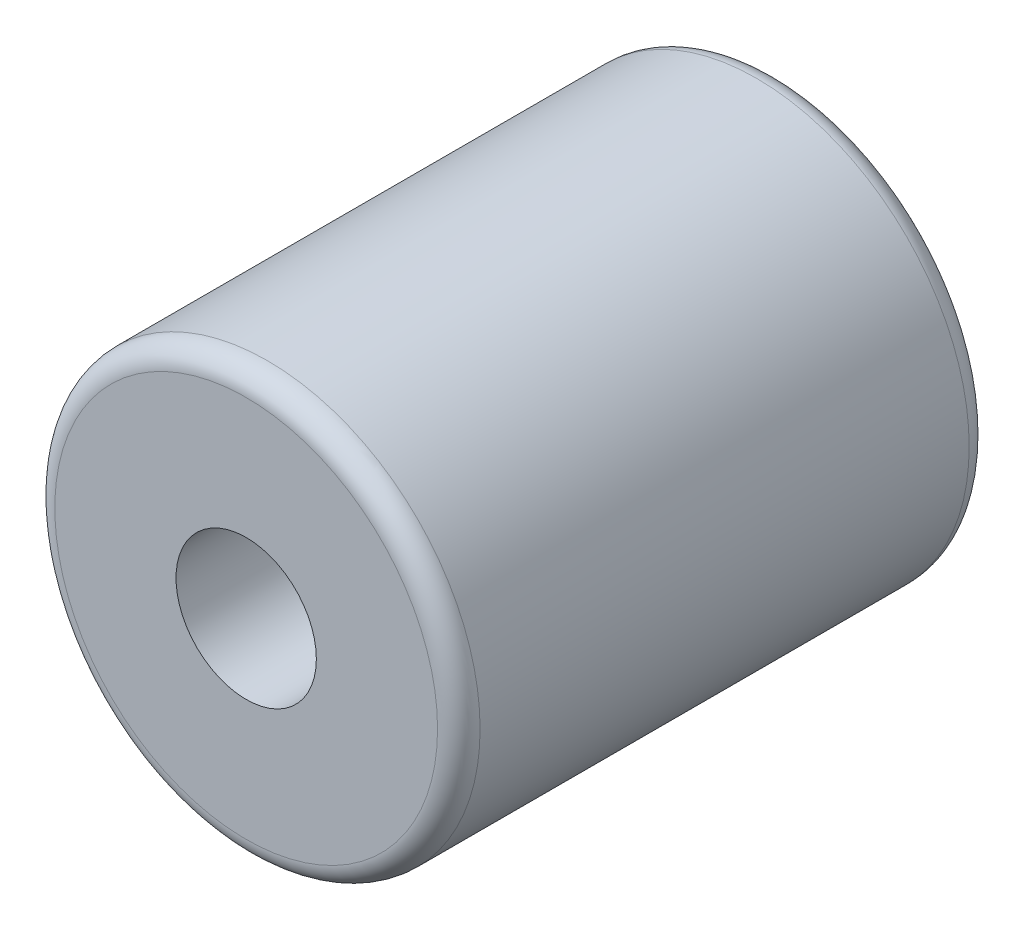
ISO-10303-21;
HEADER;
FILE_DESCRIPTION(('STEP AP214'),'2;1');
FILE_NAME('part.step','',(''),(''),'','','');
FILE_SCHEMA(('AUTOMOTIVE_DESIGN { 1 0 10303 214 1 1 1 1 }'));
ENDSEC;
DATA;
#1=APPLICATION_CONTEXT('core data for automotive mechanical design processes');
#2=APPLICATION_PROTOCOL_DEFINITION('international standard','automotive_design',2000,#1);
#3=PRODUCT_CONTEXT('',#1,'mechanical');
#4=PRODUCT('Part','Part','',(#3));
#5=PRODUCT_RELATED_PRODUCT_CATEGORY('part','',(#4));
#6=PRODUCT_DEFINITION_FORMATION('','',#4);
#7=PRODUCT_DEFINITION_CONTEXT('part definition',#1,'design');
#8=PRODUCT_DEFINITION('design','',#6,#7);
#9=PRODUCT_DEFINITION_SHAPE('','',#8);
#10=(LENGTH_UNIT() NAMED_UNIT(*) SI_UNIT(.MILLI.,.METRE.));
#11=(NAMED_UNIT(*) PLANE_ANGLE_UNIT() SI_UNIT($,.RADIAN.));
#12=(NAMED_UNIT(*) SI_UNIT($,.STERADIAN.) SOLID_ANGLE_UNIT());
#13=UNCERTAINTY_MEASURE_WITH_UNIT(LENGTH_MEASURE(1.E-05),#10,'distance_accuracy_value','');
#14=(GEOMETRIC_REPRESENTATION_CONTEXT(3) GLOBAL_UNCERTAINTY_ASSIGNED_CONTEXT((#13)) GLOBAL_UNIT_ASSIGNED_CONTEXT((#10,
#11,#12)) REPRESENTATION_CONTEXT('',''));
#15=CARTESIAN_POINT('',(0.,0.,0.));
#16=DIRECTION('',(0.,0.,1.));
#17=DIRECTION('',(1.,0.,0.));
#18=AXIS2_PLACEMENT_3D('',#15,#16,#17);
#19=CARTESIAN_POINT('',(0.,0.,25.));
#20=DIRECTION('',(0.,0.,-1.));
#21=DIRECTION('',(-1.,0.,0.));
#22=AXIS2_PLACEMENT_3D('',#19,#20,#21);
#23=CYLINDRICAL_SURFACE('',#22,10.);
#24=CARTESIAN_POINT('',(0.,0.,24.));
#25=DIRECTION('',(0.,0.,1.));
#26=DIRECTION('',(1.,0.,0.));
#27=AXIS2_PLACEMENT_3D('',#24,#25,#26);
#28=CIRCLE('',#27,10.);
#29=CARTESIAN_POINT('',(10.,0.,24.));
#30=VERTEX_POINT('',#29);
#31=EDGE_CURVE('E51',#30,#30,#28,.F.);
#32=ORIENTED_EDGE('',*,*,#31,.T.);
#33=EDGE_LOOP('',(#32));
#34=FACE_BOUND('',#33,.T.);
#35=CARTESIAN_POINT('',(0.,0.,1.));
#36=DIRECTION('',(0.,0.,1.));
#37=DIRECTION('',(1.,0.,0.));
#38=AXIS2_PLACEMENT_3D('',#35,#36,#37);
#39=CIRCLE('',#38,10.);
#40=CARTESIAN_POINT('',(10.,0.,1.));
#41=VERTEX_POINT('',#40);
#42=EDGE_CURVE('E55',#41,#41,#39,.T.);
#43=ORIENTED_EDGE('',*,*,#42,.T.);
#44=EDGE_LOOP('',(#43));
#45=FACE_BOUND('',#44,.T.);
#46=ADVANCED_FACE('F43',(#34,#45),#23,.T.);
#47=CARTESIAN_POINT('',(0.,0.,25.));
#48=DIRECTION('',(0.,0.,1.));
#49=DIRECTION('',(1.,0.,0.));
#50=AXIS2_PLACEMENT_3D('',#47,#48,#49);
#51=PLANE('',#50);
#52=CARTESIAN_POINT('',(0.,0.,25.));
#53=DIRECTION('',(0.,0.,1.));
#54=DIRECTION('',(1.,0.,0.));
#55=AXIS2_PLACEMENT_3D('',#52,#53,#54);
#56=CIRCLE('',#55,9.);
#57=CARTESIAN_POINT('',(9.,0.,25.));
#58=VERTEX_POINT('',#57);
#59=EDGE_CURVE('E60',#58,#58,#56,.T.);
#60=ORIENTED_EDGE('',*,*,#59,.T.);
#61=EDGE_LOOP('',(#60));
#62=FACE_BOUND('',#61,.T.);
#63=CARTESIAN_POINT('',(0.,0.,25.));
#64=DIRECTION('',(0.,0.,1.));
#65=DIRECTION('',(1.,0.,0.));
#66=AXIS2_PLACEMENT_3D('',#63,#64,#65);
#67=CIRCLE('',#66,3.3);
#68=CARTESIAN_POINT('',(3.3,0.,25.));
#69=VERTEX_POINT('',#68);
#70=EDGE_CURVE('E64',#69,#69,#67,.T.);
#71=ORIENTED_EDGE('',*,*,#70,.F.);
#72=EDGE_LOOP('',(#71));
#73=FACE_BOUND('',#72,.T.);
#74=ADVANCED_FACE('F92',(#62,#73),#51,.T.);
#75=CARTESIAN_POINT('',(0.,0.,0.));
#76=DIRECTION('',(0.,0.,1.));
#77=DIRECTION('',(1.,0.,0.));
#78=AXIS2_PLACEMENT_3D('',#75,#76,#77);
#79=PLANE('',#78);
#80=CARTESIAN_POINT('',(0.,0.,0.));
#81=DIRECTION('',(0.,0.,-1.));
#82=DIRECTION('',(-1.,0.,0.));
#83=AXIS2_PLACEMENT_3D('',#80,#81,#82);
#84=CIRCLE('',#83,2.);
#85=CARTESIAN_POINT('',(-2.,0.,0.));
#86=VERTEX_POINT('',#85);
#87=EDGE_CURVE('E69',#86,#86,#84,.T.);
#88=ORIENTED_EDGE('',*,*,#87,.F.);
#89=EDGE_LOOP('',(#88));
#90=FACE_BOUND('',#89,.T.);
#91=CARTESIAN_POINT('',(0.,0.,0.));
#92=DIRECTION('',(0.,0.,1.));
#93=DIRECTION('',(1.,0.,0.));
#94=AXIS2_PLACEMENT_3D('',#91,#92,#93);
#95=CIRCLE('',#94,9.);
#96=CARTESIAN_POINT('',(9.,0.,0.));
#97=VERTEX_POINT('',#96);
#98=EDGE_CURVE('E10',#97,#97,#95,.F.);
#99=ORIENTED_EDGE('',*,*,#98,.T.);
#100=EDGE_LOOP('',(#99));
#101=FACE_BOUND('',#100,.T.);
#102=ADVANCED_FACE('F88',(#90,#101),#79,.F.);
#103=CARTESIAN_POINT('',(0.,0.,13.));
#104=DIRECTION('',(0.,0.,1.));
#105=DIRECTION('',(1.,0.,0.));
#106=AXIS2_PLACEMENT_3D('',#103,#104,#105);
#107=CYLINDRICAL_SURFACE('',#106,3.3);
#108=CARTESIAN_POINT('',(0.,0.,13.));
#109=DIRECTION('',(0.,0.,1.));
#110=DIRECTION('',(1.,0.,0.));
#111=AXIS2_PLACEMENT_3D('',#108,#109,#110);
#112=CIRCLE('',#111,3.3);
#113=CARTESIAN_POINT('',(3.3,0.,13.));
#114=VERTEX_POINT('',#113);
#115=EDGE_CURVE('E63',#114,#114,#112,.T.);
#116=ORIENTED_EDGE('',*,*,#115,.F.);
#117=EDGE_LOOP('',(#116));
#118=FACE_BOUND('',#117,.T.);
#119=ORIENTED_EDGE('',*,*,#70,.T.);
#120=EDGE_LOOP('',(#119));
#121=FACE_BOUND('',#120,.T.);
#122=ADVANCED_FACE('F82',(#118,#121),#107,.F.);
#123=CARTESIAN_POINT('',(0.,0.,13.));
#124=DIRECTION('',(0.,0.,1.));
#125=DIRECTION('',(1.,0.,0.));
#126=AXIS2_PLACEMENT_3D('',#123,#124,#125);
#127=PLANE('',#126);
#128=CARTESIAN_POINT('',(0.,0.,13.));
#129=DIRECTION('',(0.,0.,1.));
#130=DIRECTION('',(1.,0.,0.));
#131=AXIS2_PLACEMENT_3D('',#128,#129,#130);
#132=CIRCLE('',#131,2.);
#133=CARTESIAN_POINT('',(2.,0.,13.));
#134=VERTEX_POINT('',#133);
#135=EDGE_CURVE('E47',#134,#134,#132,.T.);
#136=ORIENTED_EDGE('',*,*,#135,.F.);
#137=EDGE_LOOP('',(#136));
#138=FACE_BOUND('',#137,.T.);
#139=ORIENTED_EDGE('',*,*,#115,.T.);
#140=EDGE_LOOP('',(#139));
#141=FACE_BOUND('',#140,.T.);
#142=ADVANCED_FACE('F78',(#138,#141),#127,.T.);
#143=CARTESIAN_POINT('',(0.,0.,24.));
#144=DIRECTION('',(0.,0.,1.));
#145=DIRECTION('',(1.,0.,0.));
#146=AXIS2_PLACEMENT_3D('',#143,#144,#145);
#147=TOROIDAL_SURFACE('',#146,9.,1.);
#148=ORIENTED_EDGE('',*,*,#31,.F.);
#149=EDGE_LOOP('',(#148));
#150=FACE_BOUND('',#149,.T.);
#151=ORIENTED_EDGE('',*,*,#59,.F.);
#152=EDGE_LOOP('',(#151));
#153=FACE_BOUND('',#152,.T.);
#154=ADVANCED_FACE('F81',(#150,#153),#147,.T.);
#155=CARTESIAN_POINT('',(0.,0.,1.));
#156=DIRECTION('',(0.,0.,1.));
#157=DIRECTION('',(1.,0.,0.));
#158=AXIS2_PLACEMENT_3D('',#155,#156,#157);
#159=TOROIDAL_SURFACE('',#158,9.,1.);
#160=ORIENTED_EDGE('',*,*,#98,.F.);
#161=EDGE_LOOP('',(#160));
#162=FACE_BOUND('',#161,.T.);
#163=ORIENTED_EDGE('',*,*,#42,.F.);
#164=EDGE_LOOP('',(#163));
#165=FACE_BOUND('',#164,.T.);
#166=ADVANCED_FACE('F45',(#162,#165),#159,.T.);
#167=CARTESIAN_POINT('',(0.,0.,25.));
#168=DIRECTION('',(0.,0.,-1.));
#169=DIRECTION('',(-1.,0.,0.));
#170=AXIS2_PLACEMENT_3D('',#167,#168,#169);
#171=CYLINDRICAL_SURFACE('',#170,2.);
#172=ORIENTED_EDGE('',*,*,#135,.T.);
#173=EDGE_LOOP('',(#172));
#174=FACE_BOUND('',#173,.T.);
#175=ORIENTED_EDGE('',*,*,#87,.T.);
#176=EDGE_LOOP('',(#175));
#177=FACE_BOUND('',#176,.T.);
#178=ADVANCED_FACE('F76',(#174,#177),#171,.F.);
#179=CLOSED_SHELL('',(#46,#74,#102,#122,#142,#154,#166,#178));
#180=MANIFOLD_SOLID_BREP('B2',#179);
#181=ADVANCED_BREP_SHAPE_REPRESENTATION('',(#18,#180),#14);
#182=SHAPE_DEFINITION_REPRESENTATION(#9,#181);
ENDSEC;
END-ISO-10303-21;
